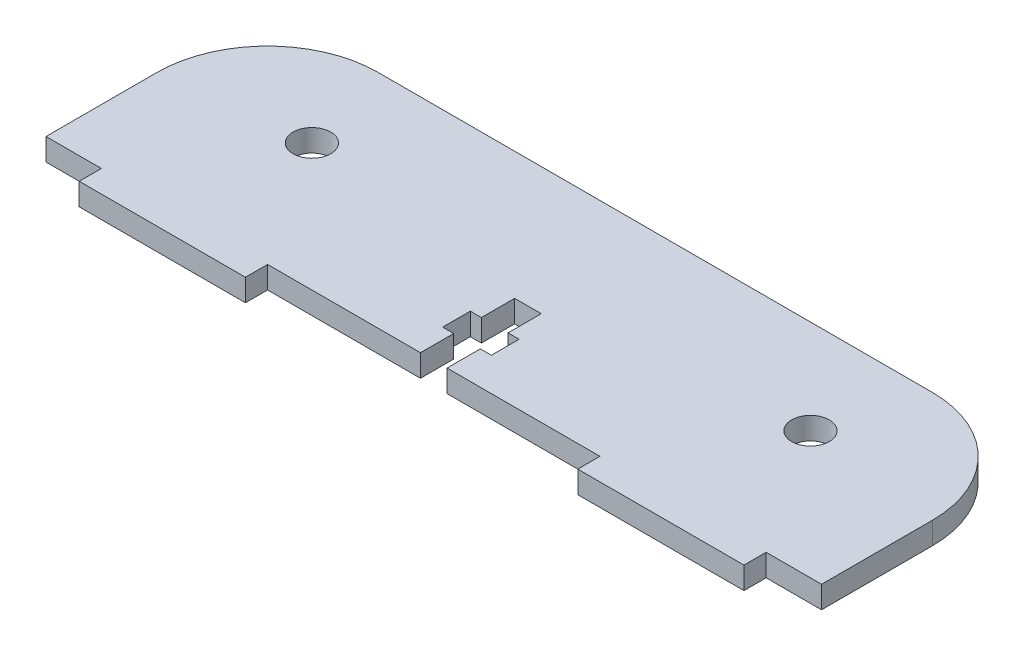
ISO-10303-21;
HEADER;
FILE_DESCRIPTION(('STEP AP214'),'2;1');
FILE_NAME('part.step','',(''),(''),'','','');
FILE_SCHEMA(('AUTOMOTIVE_DESIGN { 1 0 10303 214 1 1 1 1 }'));
ENDSEC;
DATA;
#1=APPLICATION_CONTEXT('core data for automotive mechanical design processes');
#2=APPLICATION_PROTOCOL_DEFINITION('international standard','automotive_design',2000,#1);
#3=PRODUCT_CONTEXT('',#1,'mechanical');
#4=PRODUCT('Part','Part','',(#3));
#5=PRODUCT_RELATED_PRODUCT_CATEGORY('part','',(#4));
#6=PRODUCT_DEFINITION_FORMATION('','',#4);
#7=PRODUCT_DEFINITION_CONTEXT('part definition',#1,'design');
#8=PRODUCT_DEFINITION('design','',#6,#7);
#9=PRODUCT_DEFINITION_SHAPE('','',#8);
#10=(LENGTH_UNIT() NAMED_UNIT(*) SI_UNIT(.MILLI.,.METRE.));
#11=(NAMED_UNIT(*) PLANE_ANGLE_UNIT() SI_UNIT($,.RADIAN.));
#12=(NAMED_UNIT(*) SI_UNIT($,.STERADIAN.) SOLID_ANGLE_UNIT());
#13=UNCERTAINTY_MEASURE_WITH_UNIT(LENGTH_MEASURE(1.E-05),#10,'distance_accuracy_value','');
#14=(GEOMETRIC_REPRESENTATION_CONTEXT(3) GLOBAL_UNCERTAINTY_ASSIGNED_CONTEXT((#13)) GLOBAL_UNIT_ASSIGNED_CONTEXT((#10,
#11,#12)) REPRESENTATION_CONTEXT('',''));
#15=CARTESIAN_POINT('',(0.,0.,0.));
#16=DIRECTION('',(0.,0.,1.));
#17=DIRECTION('',(1.,0.,0.));
#18=AXIS2_PLACEMENT_3D('',#15,#16,#17);
#19=CARTESIAN_POINT('',(0.,2.,20.));
#20=DIRECTION('',(0.,0.,-1.));
#21=DIRECTION('',(-1.,0.,0.));
#22=AXIS2_PLACEMENT_3D('',#19,#20,#21);
#23=PLANE('',#22);
#24=DIRECTION('',(1.,0.,0.));
#25=VECTOR('',#24,1.);
#26=CARTESIAN_POINT('',(0.,2.,20.));
#27=LINE('',#26,#25);
#28=CARTESIAN_POINT('',(65.,2.,20.));
#29=VERTEX_POINT('',#28);
#30=CARTESIAN_POINT('',(70.,2.,20.));
#31=VERTEX_POINT('',#30);
#32=EDGE_CURVE('E285',#29,#31,#27,.T.);
#33=ORIENTED_EDGE('',*,*,#32,.F.);
#34=DIRECTION('',(0.,1.,0.));
#35=VECTOR('',#34,1.);
#36=CARTESIAN_POINT('',(65.,0.,20.));
#37=LINE('',#36,#35);
#38=CARTESIAN_POINT('',(65.,0.,20.));
#39=VERTEX_POINT('',#38);
#40=EDGE_CURVE('E299',#39,#29,#37,.T.);
#41=ORIENTED_EDGE('',*,*,#40,.F.);
#42=DIRECTION('',(1.,0.,0.));
#43=VECTOR('',#42,1.);
#44=CARTESIAN_POINT('',(0.,0.,20.));
#45=LINE('',#44,#43);
#46=CARTESIAN_POINT('',(70.,0.,20.));
#47=VERTEX_POINT('',#46);
#48=EDGE_CURVE('E239',#39,#47,#45,.T.);
#49=ORIENTED_EDGE('',*,*,#48,.T.);
#50=DIRECTION('',(0.,-1.,0.));
#51=VECTOR('',#50,1.);
#52=CARTESIAN_POINT('',(70.,2.,20.));
#53=LINE('',#52,#51);
#54=EDGE_CURVE('E256',#31,#47,#53,.T.);
#55=ORIENTED_EDGE('',*,*,#54,.F.);
#56=EDGE_LOOP('',(#33,#41,#49,#55));
#57=FACE_BOUND('',#56,.T.);
#58=ADVANCED_FACE('F34',(#57),#23,.F.);
#59=CARTESIAN_POINT('',(20.,2.,20.));
#60=VERTEX_POINT('',#59);
#61=CARTESIAN_POINT('',(33.8,2.,20.));
#62=VERTEX_POINT('',#61);
#63=EDGE_CURVE('E305',#60,#62,#27,.T.);
#64=ORIENTED_EDGE('',*,*,#63,.F.);
#65=DIRECTION('',(0.,1.,0.));
#66=VECTOR('',#65,1.);
#67=CARTESIAN_POINT('',(20.,0.,20.));
#68=LINE('',#67,#66);
#69=CARTESIAN_POINT('',(20.,0.,20.));
#70=VERTEX_POINT('',#69);
#71=EDGE_CURVE('E382',#70,#60,#68,.T.);
#72=ORIENTED_EDGE('',*,*,#71,.F.);
#73=CARTESIAN_POINT('',(33.8,0.,20.));
#74=VERTEX_POINT('',#73);
#75=EDGE_CURVE('E238',#70,#74,#45,.T.);
#76=ORIENTED_EDGE('',*,*,#75,.T.);
#77=DIRECTION('',(0.,1.,0.));
#78=VECTOR('',#77,1.);
#79=CARTESIAN_POINT('',(33.8,0.,20.));
#80=LINE('',#79,#78);
#81=EDGE_CURVE('E321',#74,#62,#80,.T.);
#82=ORIENTED_EDGE('',*,*,#81,.T.);
#83=EDGE_LOOP('',(#64,#72,#76,#82));
#84=FACE_BOUND('',#83,.T.);
#85=ADVANCED_FACE('F469',(#84),#23,.F.);
#86=CARTESIAN_POINT('',(0.,0.,20.));
#87=VERTEX_POINT('',#86);
#88=CARTESIAN_POINT('',(5.,0.,20.));
#89=VERTEX_POINT('',#88);
#90=EDGE_CURVE('E241',#87,#89,#45,.T.);
#91=ORIENTED_EDGE('',*,*,#90,.T.);
#92=DIRECTION('',(0.,1.,0.));
#93=VECTOR('',#92,1.);
#94=CARTESIAN_POINT('',(5.,0.,20.));
#95=LINE('',#94,#93);
#96=CARTESIAN_POINT('',(5.,2.,20.));
#97=VERTEX_POINT('',#96);
#98=EDGE_CURVE('E413',#89,#97,#95,.T.);
#99=ORIENTED_EDGE('',*,*,#98,.T.);
#100=CARTESIAN_POINT('',(0.,2.,20.));
#101=VERTEX_POINT('',#100);
#102=EDGE_CURVE('E302',#101,#97,#27,.T.);
#103=ORIENTED_EDGE('',*,*,#102,.F.);
#104=DIRECTION('',(0.,-1.,0.));
#105=VECTOR('',#104,1.);
#106=CARTESIAN_POINT('',(0.,2.,20.));
#107=LINE('',#106,#105);
#108=EDGE_CURVE('E258',#101,#87,#107,.T.);
#109=ORIENTED_EDGE('',*,*,#108,.T.);
#110=EDGE_LOOP('',(#91,#99,#103,#109));
#111=FACE_BOUND('',#110,.T.);
#112=ADVANCED_FACE('F474',(#111),#23,.F.);
#113=CARTESIAN_POINT('',(0.,2.,0.));
#114=DIRECTION('',(0.,1.,0.));
#115=DIRECTION('',(0.,0.,1.));
#116=AXIS2_PLACEMENT_3D('',#113,#114,#115);
#117=PLANE('',#116);
#118=DIRECTION('',(-1.,0.,0.));
#119=VECTOR('',#118,1.);
#120=CARTESIAN_POINT('',(0.,2.,0.));
#121=LINE('',#120,#119);
#122=CARTESIAN_POINT('',(60.,2.,0.));
#123=VERTEX_POINT('',#122);
#124=CARTESIAN_POINT('',(10.,2.,0.));
#125=VERTEX_POINT('',#124);
#126=EDGE_CURVE('E259',#123,#125,#121,.T.);
#127=ORIENTED_EDGE('',*,*,#126,.T.);
#128=CARTESIAN_POINT('',(10.,2.,10.));
#129=DIRECTION('',(0.,1.,0.));
#130=DIRECTION('',(0.,0.,1.));
#131=AXIS2_PLACEMENT_3D('',#128,#129,#130);
#132=CIRCLE('',#131,10.);
#133=CARTESIAN_POINT('',(0.,2.,10.));
#134=VERTEX_POINT('',#133);
#135=EDGE_CURVE('E42',#125,#134,#132,.T.);
#136=ORIENTED_EDGE('',*,*,#135,.T.);
#137=DIRECTION('',(0.,0.,1.));
#138=VECTOR('',#137,1.);
#139=CARTESIAN_POINT('',(0.,2.,0.));
#140=LINE('',#139,#138);
#141=EDGE_CURVE('E253',#134,#101,#140,.T.);
#142=ORIENTED_EDGE('',*,*,#141,.T.);
#143=ORIENTED_EDGE('',*,*,#102,.T.);
#144=DIRECTION('',(0.,0.,1.));
#145=VECTOR('',#144,1.);
#146=CARTESIAN_POINT('',(5.,2.,22.));
#147=LINE('',#146,#145);
#148=CARTESIAN_POINT('',(5.,2.,22.));
#149=VERTEX_POINT('',#148);
#150=EDGE_CURVE('E429',#97,#149,#147,.T.);
#151=ORIENTED_EDGE('',*,*,#150,.T.);
#152=DIRECTION('',(1.,0.,0.));
#153=VECTOR('',#152,1.);
#154=CARTESIAN_POINT('',(20.,2.,22.));
#155=LINE('',#154,#153);
#156=CARTESIAN_POINT('',(20.,2.,22.));
#157=VERTEX_POINT('',#156);
#158=EDGE_CURVE('E426',#149,#157,#155,.T.);
#159=ORIENTED_EDGE('',*,*,#158,.T.);
#160=DIRECTION('',(0.,0.,-1.));
#161=VECTOR('',#160,1.);
#162=CARTESIAN_POINT('',(20.,2.,20.));
#163=LINE('',#162,#161);
#164=EDGE_CURVE('E422',#157,#60,#163,.T.);
#165=ORIENTED_EDGE('',*,*,#164,.T.);
#166=ORIENTED_EDGE('',*,*,#63,.T.);
#167=DIRECTION('',(0.,0.,1.));
#168=VECTOR('',#167,1.);
#169=CARTESIAN_POINT('',(33.8,2.,20.));
#170=LINE('',#169,#168);
#171=CARTESIAN_POINT('',(33.8,2.,17.));
#172=VERTEX_POINT('',#171);
#173=EDGE_CURVE('E348',#172,#62,#170,.T.);
#174=ORIENTED_EDGE('',*,*,#173,.F.);
#175=DIRECTION('',(1.,0.,0.));
#176=VECTOR('',#175,1.);
#177=CARTESIAN_POINT('',(33.8,2.,17.));
#178=LINE('',#177,#176);
#179=CARTESIAN_POINT('',(32.8,2.,17.));
#180=VERTEX_POINT('',#179);
#181=EDGE_CURVE('E352',#180,#172,#178,.T.);
#182=ORIENTED_EDGE('',*,*,#181,.F.);
#183=DIRECTION('',(0.,0.,1.));
#184=VECTOR('',#183,1.);
#185=CARTESIAN_POINT('',(32.8,2.,17.));
#186=LINE('',#185,#184);
#187=CARTESIAN_POINT('',(32.8,2.,14.5));
#188=VERTEX_POINT('',#187);
#189=EDGE_CURVE('E355',#188,#180,#186,.T.);
#190=ORIENTED_EDGE('',*,*,#189,.F.);
#191=DIRECTION('',(-1.,0.,0.));
#192=VECTOR('',#191,1.);
#193=CARTESIAN_POINT('',(32.8,2.,14.5));
#194=LINE('',#193,#192);
#195=CARTESIAN_POINT('',(33.8,2.,14.5));
#196=VERTEX_POINT('',#195);
#197=EDGE_CURVE('E358',#196,#188,#194,.T.);
#198=ORIENTED_EDGE('',*,*,#197,.F.);
#199=DIRECTION('',(0.,0.,1.));
#200=VECTOR('',#199,1.);
#201=CARTESIAN_POINT('',(33.8,2.,14.5));
#202=LINE('',#201,#200);
#203=CARTESIAN_POINT('',(33.8,2.,11.5));
#204=VERTEX_POINT('',#203);
#205=EDGE_CURVE('E361',#204,#196,#202,.T.);
#206=ORIENTED_EDGE('',*,*,#205,.F.);
#207=DIRECTION('',(-1.,0.,0.));
#208=VECTOR('',#207,1.);
#209=CARTESIAN_POINT('',(33.8,2.,11.5));
#210=LINE('',#209,#208);
#211=CARTESIAN_POINT('',(36.2,2.,11.5));
#212=VERTEX_POINT('',#211);
#213=EDGE_CURVE('E364',#212,#204,#210,.T.);
#214=ORIENTED_EDGE('',*,*,#213,.F.);
#215=DIRECTION('',(0.,0.,-1.));
#216=VECTOR('',#215,1.);
#217=CARTESIAN_POINT('',(36.2,2.,11.5));
#218=LINE('',#217,#216);
#219=CARTESIAN_POINT('',(36.2,2.,14.5));
#220=VERTEX_POINT('',#219);
#221=EDGE_CURVE('E367',#220,#212,#218,.T.);
#222=ORIENTED_EDGE('',*,*,#221,.F.);
#223=DIRECTION('',(-1.,0.,0.));
#224=VECTOR('',#223,1.);
#225=CARTESIAN_POINT('',(36.2,2.,14.5));
#226=LINE('',#225,#224);
#227=CARTESIAN_POINT('',(37.2,2.,14.5));
#228=VERTEX_POINT('',#227);
#229=EDGE_CURVE('E370',#228,#220,#226,.T.);
#230=ORIENTED_EDGE('',*,*,#229,.F.);
#231=DIRECTION('',(0.,0.,-1.));
#232=VECTOR('',#231,1.);
#233=CARTESIAN_POINT('',(37.2,2.,14.5));
#234=LINE('',#233,#232);
#235=CARTESIAN_POINT('',(37.2,2.,17.));
#236=VERTEX_POINT('',#235);
#237=EDGE_CURVE('E373',#236,#228,#234,.T.);
#238=ORIENTED_EDGE('',*,*,#237,.F.);
#239=DIRECTION('',(1.,0.,0.));
#240=VECTOR('',#239,1.);
#241=CARTESIAN_POINT('',(37.2,2.,17.));
#242=LINE('',#241,#240);
#243=CARTESIAN_POINT('',(36.2,2.,17.));
#244=VERTEX_POINT('',#243);
#245=EDGE_CURVE('E376',#244,#236,#242,.T.);
#246=ORIENTED_EDGE('',*,*,#245,.F.);
#247=DIRECTION('',(0.,0.,-1.));
#248=VECTOR('',#247,1.);
#249=CARTESIAN_POINT('',(36.2,2.,17.));
#250=LINE('',#249,#248);
#251=CARTESIAN_POINT('',(36.2,2.,20.));
#252=VERTEX_POINT('',#251);
#253=EDGE_CURVE('E379',#252,#244,#250,.T.);
#254=ORIENTED_EDGE('',*,*,#253,.F.);
#255=CARTESIAN_POINT('',(50.,2.,20.));
#256=VERTEX_POINT('',#255);
#257=EDGE_CURVE('E307',#252,#256,#27,.T.);
#258=ORIENTED_EDGE('',*,*,#257,.T.);
#259=DIRECTION('',(0.,0.,1.));
#260=VECTOR('',#259,1.);
#261=CARTESIAN_POINT('',(50.,2.,20.));
#262=LINE('',#261,#260);
#263=CARTESIAN_POINT('',(50.,2.,22.));
#264=VERTEX_POINT('',#263);
#265=EDGE_CURVE('E214',#256,#264,#262,.T.);
#266=ORIENTED_EDGE('',*,*,#265,.T.);
#267=DIRECTION('',(1.,0.,0.));
#268=VECTOR('',#267,1.);
#269=CARTESIAN_POINT('',(50.,2.,22.));
#270=LINE('',#269,#268);
#271=CARTESIAN_POINT('',(65.,2.,22.));
#272=VERTEX_POINT('',#271);
#273=EDGE_CURVE('E444',#264,#272,#270,.T.);
#274=ORIENTED_EDGE('',*,*,#273,.T.);
#275=DIRECTION('',(0.,0.,-1.));
#276=VECTOR('',#275,1.);
#277=CARTESIAN_POINT('',(65.,2.,22.));
#278=LINE('',#277,#276);
#279=EDGE_CURVE('E233',#272,#29,#278,.T.);
#280=ORIENTED_EDGE('',*,*,#279,.T.);
#281=ORIENTED_EDGE('',*,*,#32,.T.);
#282=DIRECTION('',(0.,0.,-1.));
#283=VECTOR('',#282,1.);
#284=CARTESIAN_POINT('',(70.,2.,0.));
#285=LINE('',#284,#283);
#286=CARTESIAN_POINT('',(70.,2.,10.));
#287=VERTEX_POINT('',#286);
#288=EDGE_CURVE('E301',#31,#287,#285,.T.);
#289=ORIENTED_EDGE('',*,*,#288,.T.);
#290=CARTESIAN_POINT('',(60.,2.,10.));
#291=DIRECTION('',(0.,1.,0.));
#292=DIRECTION('',(0.,0.,1.));
#293=AXIS2_PLACEMENT_3D('',#290,#291,#292);
#294=CIRCLE('',#293,10.);
#295=EDGE_CURVE('E272',#287,#123,#294,.T.);
#296=ORIENTED_EDGE('',*,*,#295,.T.);
#297=EDGE_LOOP('',(#127,#136,#142,#143,#151,#159,#165,#166,#174,#182,#190,#198,#206,#214,#222,
#230,#238,#246,#254,#258,#266,#274,#280,#281,#289,#296));
#298=FACE_BOUND('',#297,.T.);
#299=CARTESIAN_POINT('',(57.5,2.,8.5));
#300=DIRECTION('',(0.,1.,0.));
#301=DIRECTION('',(0.,0.,1.));
#302=AXIS2_PLACEMENT_3D('',#299,#300,#301);
#303=CIRCLE('',#302,1.7);
#304=CARTESIAN_POINT('',(57.5,2.,10.2));
#305=VERTEX_POINT('',#304);
#306=EDGE_CURVE('E308',#305,#305,#303,.T.);
#307=ORIENTED_EDGE('',*,*,#306,.F.);
#308=EDGE_LOOP('',(#307));
#309=FACE_BOUND('',#308,.T.);
#310=CARTESIAN_POINT('',(12.5,2.,8.5));
#311=DIRECTION('',(0.,1.,0.));
#312=DIRECTION('',(0.,0.,1.));
#313=AXIS2_PLACEMENT_3D('',#310,#311,#312);
#314=CIRCLE('',#313,1.7);
#315=CARTESIAN_POINT('',(12.5,2.,10.2));
#316=VERTEX_POINT('',#315);
#317=EDGE_CURVE('E315',#316,#316,#314,.T.);
#318=ORIENTED_EDGE('',*,*,#317,.F.);
#319=EDGE_LOOP('',(#318));
#320=FACE_BOUND('',#319,.T.);
#321=ADVANCED_FACE('F276',(#298,#309,#320),#117,.T.);
#322=CARTESIAN_POINT('',(0.,0.,0.));
#323=DIRECTION('',(0.,1.,0.));
#324=DIRECTION('',(0.,0.,1.));
#325=AXIS2_PLACEMENT_3D('',#322,#323,#324);
#326=PLANE('',#325);
#327=DIRECTION('',(0.,0.,1.));
#328=VECTOR('',#327,1.);
#329=CARTESIAN_POINT('',(0.,0.,0.));
#330=LINE('',#329,#328);
#331=CARTESIAN_POINT('',(0.,0.,10.));
#332=VERTEX_POINT('',#331);
#333=EDGE_CURVE('E242',#332,#87,#330,.T.);
#334=ORIENTED_EDGE('',*,*,#333,.F.);
#335=CARTESIAN_POINT('',(10.,0.,10.));
#336=DIRECTION('',(0.,1.,0.));
#337=DIRECTION('',(0.,0.,1.));
#338=AXIS2_PLACEMENT_3D('',#335,#336,#337);
#339=CIRCLE('',#338,10.);
#340=CARTESIAN_POINT('',(10.,0.,0.));
#341=VERTEX_POINT('',#340);
#342=EDGE_CURVE('E266',#332,#341,#339,.F.);
#343=ORIENTED_EDGE('',*,*,#342,.T.);
#344=DIRECTION('',(-1.,0.,0.));
#345=VECTOR('',#344,1.);
#346=CARTESIAN_POINT('',(0.,0.,0.));
#347=LINE('',#346,#345);
#348=CARTESIAN_POINT('',(60.,0.,0.));
#349=VERTEX_POINT('',#348);
#350=EDGE_CURVE('E250',#349,#341,#347,.T.);
#351=ORIENTED_EDGE('',*,*,#350,.F.);
#352=CARTESIAN_POINT('',(60.,0.,10.));
#353=DIRECTION('',(0.,1.,0.));
#354=DIRECTION('',(0.,0.,1.));
#355=AXIS2_PLACEMENT_3D('',#352,#353,#354);
#356=CIRCLE('',#355,10.);
#357=CARTESIAN_POINT('',(70.,0.,10.));
#358=VERTEX_POINT('',#357);
#359=EDGE_CURVE('E264',#349,#358,#356,.F.);
#360=ORIENTED_EDGE('',*,*,#359,.T.);
#361=DIRECTION('',(0.,0.,-1.));
#362=VECTOR('',#361,1.);
#363=CARTESIAN_POINT('',(70.,0.,0.));
#364=LINE('',#363,#362);
#365=EDGE_CURVE('E245',#47,#358,#364,.T.);
#366=ORIENTED_EDGE('',*,*,#365,.F.);
#367=ORIENTED_EDGE('',*,*,#48,.F.);
#368=DIRECTION('',(0.,0.,-1.));
#369=VECTOR('',#368,1.);
#370=CARTESIAN_POINT('',(65.,0.,22.));
#371=LINE('',#370,#369);
#372=CARTESIAN_POINT('',(65.,0.,22.));
#373=VERTEX_POINT('',#372);
#374=EDGE_CURVE('E220',#373,#39,#371,.T.);
#375=ORIENTED_EDGE('',*,*,#374,.F.);
#376=DIRECTION('',(1.,0.,0.));
#377=VECTOR('',#376,1.);
#378=CARTESIAN_POINT('',(50.,0.,22.));
#379=LINE('',#378,#377);
#380=CARTESIAN_POINT('',(50.,0.,22.));
#381=VERTEX_POINT('',#380);
#382=EDGE_CURVE('E232',#381,#373,#379,.T.);
#383=ORIENTED_EDGE('',*,*,#382,.F.);
#384=DIRECTION('',(0.,0.,1.));
#385=VECTOR('',#384,1.);
#386=CARTESIAN_POINT('',(50.,0.,20.));
#387=LINE('',#386,#385);
#388=CARTESIAN_POINT('',(50.,0.,20.));
#389=VERTEX_POINT('',#388);
#390=EDGE_CURVE('E212',#389,#381,#387,.T.);
#391=ORIENTED_EDGE('',*,*,#390,.F.);
#392=CARTESIAN_POINT('',(36.2,0.,20.));
#393=VERTEX_POINT('',#392);
#394=EDGE_CURVE('E229',#393,#389,#45,.T.);
#395=ORIENTED_EDGE('',*,*,#394,.F.);
#396=DIRECTION('',(0.,0.,-1.));
#397=VECTOR('',#396,1.);
#398=CARTESIAN_POINT('',(36.2,0.,17.));
#399=LINE('',#398,#397);
#400=CARTESIAN_POINT('',(36.2,0.,17.));
#401=VERTEX_POINT('',#400);
#402=EDGE_CURVE('E351',#393,#401,#399,.T.);
#403=ORIENTED_EDGE('',*,*,#402,.T.);
#404=DIRECTION('',(1.,0.,0.));
#405=VECTOR('',#404,1.);
#406=CARTESIAN_POINT('',(37.2,0.,17.));
#407=LINE('',#406,#405);
#408=CARTESIAN_POINT('',(37.2,0.,17.));
#409=VERTEX_POINT('',#408);
#410=EDGE_CURVE('E409',#401,#409,#407,.T.);
#411=ORIENTED_EDGE('',*,*,#410,.T.);
#412=DIRECTION('',(0.,0.,-1.));
#413=VECTOR('',#412,1.);
#414=CARTESIAN_POINT('',(37.2,0.,14.5));
#415=LINE('',#414,#413);
#416=CARTESIAN_POINT('',(37.2,0.,14.5));
#417=VERTEX_POINT('',#416);
#418=EDGE_CURVE('E406',#409,#417,#415,.T.);
#419=ORIENTED_EDGE('',*,*,#418,.T.);
#420=DIRECTION('',(-1.,0.,0.));
#421=VECTOR('',#420,1.);
#422=CARTESIAN_POINT('',(36.2,0.,14.5));
#423=LINE('',#422,#421);
#424=CARTESIAN_POINT('',(36.2,0.,14.5));
#425=VERTEX_POINT('',#424);
#426=EDGE_CURVE('E403',#417,#425,#423,.T.);
#427=ORIENTED_EDGE('',*,*,#426,.T.);
#428=DIRECTION('',(0.,0.,-1.));
#429=VECTOR('',#428,1.);
#430=CARTESIAN_POINT('',(36.2,0.,11.5));
#431=LINE('',#430,#429);
#432=CARTESIAN_POINT('',(36.2,0.,11.5));
#433=VERTEX_POINT('',#432);
#434=EDGE_CURVE('E400',#425,#433,#431,.T.);
#435=ORIENTED_EDGE('',*,*,#434,.T.);
#436=DIRECTION('',(-1.,0.,0.));
#437=VECTOR('',#436,1.);
#438=CARTESIAN_POINT('',(33.8,0.,11.5));
#439=LINE('',#438,#437);
#440=CARTESIAN_POINT('',(33.8,0.,11.5));
#441=VERTEX_POINT('',#440);
#442=EDGE_CURVE('E397',#433,#441,#439,.T.);
#443=ORIENTED_EDGE('',*,*,#442,.T.);
#444=DIRECTION('',(0.,0.,1.));
#445=VECTOR('',#444,1.);
#446=CARTESIAN_POINT('',(33.8,0.,14.5));
#447=LINE('',#446,#445);
#448=CARTESIAN_POINT('',(33.8,0.,14.5));
#449=VERTEX_POINT('',#448);
#450=EDGE_CURVE('E394',#441,#449,#447,.T.);
#451=ORIENTED_EDGE('',*,*,#450,.T.);
#452=DIRECTION('',(-1.,0.,0.));
#453=VECTOR('',#452,1.);
#454=CARTESIAN_POINT('',(32.8,0.,14.5));
#455=LINE('',#454,#453);
#456=CARTESIAN_POINT('',(32.8,0.,14.5));
#457=VERTEX_POINT('',#456);
#458=EDGE_CURVE('E391',#449,#457,#455,.T.);
#459=ORIENTED_EDGE('',*,*,#458,.T.);
#460=DIRECTION('',(0.,0.,1.));
#461=VECTOR('',#460,1.);
#462=CARTESIAN_POINT('',(32.8,0.,17.));
#463=LINE('',#462,#461);
#464=CARTESIAN_POINT('',(32.8,0.,17.));
#465=VERTEX_POINT('',#464);
#466=EDGE_CURVE('E388',#457,#465,#463,.T.);
#467=ORIENTED_EDGE('',*,*,#466,.T.);
#468=DIRECTION('',(1.,0.,0.));
#469=VECTOR('',#468,1.);
#470=CARTESIAN_POINT('',(33.8,0.,17.));
#471=LINE('',#470,#469);
#472=CARTESIAN_POINT('',(33.8,0.,17.));
#473=VERTEX_POINT('',#472);
#474=EDGE_CURVE('E385',#465,#473,#471,.T.);
#475=ORIENTED_EDGE('',*,*,#474,.T.);
#476=DIRECTION('',(0.,0.,1.));
#477=VECTOR('',#476,1.);
#478=CARTESIAN_POINT('',(33.8,0.,20.));
#479=LINE('',#478,#477);
#480=EDGE_CURVE('E326',#473,#74,#479,.T.);
#481=ORIENTED_EDGE('',*,*,#480,.T.);
#482=ORIENTED_EDGE('',*,*,#75,.F.);
#483=DIRECTION('',(0.,0.,-1.));
#484=VECTOR('',#483,1.);
#485=CARTESIAN_POINT('',(20.,0.,20.));
#486=LINE('',#485,#484);
#487=CARTESIAN_POINT('',(20.,0.,22.));
#488=VERTEX_POINT('',#487);
#489=EDGE_CURVE('E416',#488,#70,#486,.T.);
#490=ORIENTED_EDGE('',*,*,#489,.F.);
#491=DIRECTION('',(1.,0.,0.));
#492=VECTOR('',#491,1.);
#493=CARTESIAN_POINT('',(20.,0.,22.));
#494=LINE('',#493,#492);
#495=CARTESIAN_POINT('',(5.,0.,22.));
#496=VERTEX_POINT('',#495);
#497=EDGE_CURVE('E434',#496,#488,#494,.T.);
#498=ORIENTED_EDGE('',*,*,#497,.F.);
#499=DIRECTION('',(0.,0.,1.));
#500=VECTOR('',#499,1.);
#501=CARTESIAN_POINT('',(5.,0.,22.));
#502=LINE('',#501,#500);
#503=EDGE_CURVE('E425',#89,#496,#502,.T.);
#504=ORIENTED_EDGE('',*,*,#503,.F.);
#505=ORIENTED_EDGE('',*,*,#90,.F.);
#506=EDGE_LOOP('',(#334,#343,#351,#360,#366,#367,#375,#383,#391,#395,#403,#411,#419,#427,#435,
#443,#451,#459,#467,#475,#481,#482,#490,#498,#504,#505));
#507=FACE_BOUND('',#506,.T.);
#508=CARTESIAN_POINT('',(57.5,0.,8.5));
#509=DIRECTION('',(0.,1.,0.));
#510=DIRECTION('',(0.,0.,1.));
#511=AXIS2_PLACEMENT_3D('',#508,#509,#510);
#512=CIRCLE('',#511,1.7);
#513=CARTESIAN_POINT('',(57.5,0.,10.2));
#514=VERTEX_POINT('',#513);
#515=EDGE_CURVE('E310',#514,#514,#512,.T.);
#516=ORIENTED_EDGE('',*,*,#515,.T.);
#517=EDGE_LOOP('',(#516));
#518=FACE_BOUND('',#517,.T.);
#519=CARTESIAN_POINT('',(12.5,0.,8.5));
#520=DIRECTION('',(0.,1.,0.));
#521=DIRECTION('',(0.,0.,1.));
#522=AXIS2_PLACEMENT_3D('',#519,#520,#521);
#523=CIRCLE('',#522,1.7);
#524=CARTESIAN_POINT('',(12.5,0.,10.2));
#525=VERTEX_POINT('',#524);
#526=EDGE_CURVE('E318',#525,#525,#523,.T.);
#527=ORIENTED_EDGE('',*,*,#526,.T.);
#528=EDGE_LOOP('',(#527));
#529=FACE_BOUND('',#528,.T.);
#530=ADVANCED_FACE('F226',(#507,#518,#529),#326,.F.);
#531=CARTESIAN_POINT('',(0.,2.,0.));
#532=DIRECTION('',(1.,0.,0.));
#533=DIRECTION('',(0.,0.,-1.));
#534=AXIS2_PLACEMENT_3D('',#531,#532,#533);
#535=PLANE('',#534);
#536=ORIENTED_EDGE('',*,*,#141,.F.);
#537=DIRECTION('',(0.,-1.,0.));
#538=VECTOR('',#537,1.);
#539=CARTESIAN_POINT('',(0.,2.,10.));
#540=LINE('',#539,#538);
#541=EDGE_CURVE('E261',#134,#332,#540,.T.);
#542=ORIENTED_EDGE('',*,*,#541,.T.);
#543=ORIENTED_EDGE('',*,*,#333,.T.);
#544=ORIENTED_EDGE('',*,*,#108,.F.);
#545=EDGE_LOOP('',(#536,#542,#543,#544));
#546=FACE_BOUND('',#545,.T.);
#547=ADVANCED_FACE('F284',(#546),#535,.F.);
#548=ORIENTED_EDGE('',*,*,#394,.T.);
#549=DIRECTION('',(0.,1.,0.));
#550=VECTOR('',#549,1.);
#551=CARTESIAN_POINT('',(50.,0.,20.));
#552=LINE('',#551,#550);
#553=EDGE_CURVE('E209',#389,#256,#552,.T.);
#554=ORIENTED_EDGE('',*,*,#553,.T.);
#555=ORIENTED_EDGE('',*,*,#257,.F.);
#556=DIRECTION('',(0.,1.,0.));
#557=VECTOR('',#556,1.);
#558=CARTESIAN_POINT('',(36.2,0.,20.));
#559=LINE('',#558,#557);
#560=EDGE_CURVE('E237',#393,#252,#559,.T.);
#561=ORIENTED_EDGE('',*,*,#560,.F.);
#562=EDGE_LOOP('',(#548,#554,#555,#561));
#563=FACE_BOUND('',#562,.T.);
#564=ADVANCED_FACE('F236',(#563),#23,.F.);
#565=CARTESIAN_POINT('',(70.,2.,0.));
#566=DIRECTION('',(-1.,0.,0.));
#567=DIRECTION('',(0.,0.,1.));
#568=AXIS2_PLACEMENT_3D('',#565,#566,#567);
#569=PLANE('',#568);
#570=ORIENTED_EDGE('',*,*,#365,.T.);
#571=DIRECTION('',(0.,-1.,0.));
#572=VECTOR('',#571,1.);
#573=CARTESIAN_POINT('',(70.,2.,10.));
#574=LINE('',#573,#572);
#575=EDGE_CURVE('E11',#358,#287,#574,.F.);
#576=ORIENTED_EDGE('',*,*,#575,.T.);
#577=ORIENTED_EDGE('',*,*,#288,.F.);
#578=ORIENTED_EDGE('',*,*,#54,.T.);
#579=EDGE_LOOP('',(#570,#576,#577,#578));
#580=FACE_BOUND('',#579,.T.);
#581=ADVANCED_FACE('F300',(#580),#569,.F.);
#582=CARTESIAN_POINT('',(0.,2.,0.));
#583=DIRECTION('',(0.,0.,1.));
#584=DIRECTION('',(1.,0.,0.));
#585=AXIS2_PLACEMENT_3D('',#582,#583,#584);
#586=PLANE('',#585);
#587=ORIENTED_EDGE('',*,*,#350,.T.);
#588=DIRECTION('',(0.,-1.,0.));
#589=VECTOR('',#588,1.);
#590=CARTESIAN_POINT('',(10.,2.,0.));
#591=LINE('',#590,#589);
#592=EDGE_CURVE('E55',#341,#125,#591,.F.);
#593=ORIENTED_EDGE('',*,*,#592,.T.);
#594=ORIENTED_EDGE('',*,*,#126,.F.);
#595=DIRECTION('',(0.,-1.,0.));
#596=VECTOR('',#595,1.);
#597=CARTESIAN_POINT('',(60.,2.,0.));
#598=LINE('',#597,#596);
#599=EDGE_CURVE('E268',#123,#349,#598,.T.);
#600=ORIENTED_EDGE('',*,*,#599,.T.);
#601=EDGE_LOOP('',(#587,#593,#594,#600));
#602=FACE_BOUND('',#601,.T.);
#603=ADVANCED_FACE('F289',(#602),#586,.F.);
#604=CARTESIAN_POINT('',(57.5,2.,8.5));
#605=DIRECTION('',(0.,-1.,0.));
#606=DIRECTION('',(0.,0.,-1.));
#607=AXIS2_PLACEMENT_3D('',#604,#605,#606);
#608=CYLINDRICAL_SURFACE('',#607,1.7);
#609=ORIENTED_EDGE('',*,*,#306,.T.);
#610=EDGE_LOOP('',(#609));
#611=FACE_BOUND('',#610,.T.);
#612=ORIENTED_EDGE('',*,*,#515,.F.);
#613=EDGE_LOOP('',(#612));
#614=FACE_BOUND('',#613,.T.);
#615=ADVANCED_FACE('F493',(#611,#614),#608,.F.);
#616=CARTESIAN_POINT('',(12.5,2.,8.5));
#617=DIRECTION('',(0.,-1.,0.));
#618=DIRECTION('',(0.,0.,-1.));
#619=AXIS2_PLACEMENT_3D('',#616,#617,#618);
#620=CYLINDRICAL_SURFACE('',#619,1.7);
#621=ORIENTED_EDGE('',*,*,#317,.T.);
#622=EDGE_LOOP('',(#621));
#623=FACE_BOUND('',#622,.T.);
#624=ORIENTED_EDGE('',*,*,#526,.F.);
#625=EDGE_LOOP('',(#624));
#626=FACE_BOUND('',#625,.T.);
#627=ADVANCED_FACE('F500',(#623,#626),#620,.F.);
#628=CARTESIAN_POINT('',(33.8,0.,20.));
#629=DIRECTION('',(-1.,0.,0.));
#630=DIRECTION('',(0.,0.,1.));
#631=AXIS2_PLACEMENT_3D('',#628,#629,#630);
#632=PLANE('',#631);
#633=ORIENTED_EDGE('',*,*,#173,.T.);
#634=ORIENTED_EDGE('',*,*,#81,.F.);
#635=ORIENTED_EDGE('',*,*,#480,.F.);
#636=DIRECTION('',(0.,1.,0.));
#637=VECTOR('',#636,1.);
#638=CARTESIAN_POINT('',(33.8,0.,17.));
#639=LINE('',#638,#637);
#640=EDGE_CURVE('E344',#473,#172,#639,.T.);
#641=ORIENTED_EDGE('',*,*,#640,.T.);
#642=EDGE_LOOP('',(#633,#634,#635,#641));
#643=FACE_BOUND('',#642,.T.);
#644=ADVANCED_FACE('F504',(#643),#632,.F.);
#645=CARTESIAN_POINT('',(33.8,0.,17.));
#646=DIRECTION('',(0.,0.,1.));
#647=DIRECTION('',(1.,0.,0.));
#648=AXIS2_PLACEMENT_3D('',#645,#646,#647);
#649=PLANE('',#648);
#650=ORIENTED_EDGE('',*,*,#181,.T.);
#651=ORIENTED_EDGE('',*,*,#640,.F.);
#652=ORIENTED_EDGE('',*,*,#474,.F.);
#653=DIRECTION('',(0.,1.,0.));
#654=VECTOR('',#653,1.);
#655=CARTESIAN_POINT('',(32.8,0.,17.));
#656=LINE('',#655,#654);
#657=EDGE_CURVE('E342',#465,#180,#656,.T.);
#658=ORIENTED_EDGE('',*,*,#657,.T.);
#659=EDGE_LOOP('',(#650,#651,#652,#658));
#660=FACE_BOUND('',#659,.T.);
#661=ADVANCED_FACE('F514',(#660),#649,.F.);
#662=CARTESIAN_POINT('',(32.8,0.,17.));
#663=DIRECTION('',(-1.,0.,0.));
#664=DIRECTION('',(0.,0.,1.));
#665=AXIS2_PLACEMENT_3D('',#662,#663,#664);
#666=PLANE('',#665);
#667=ORIENTED_EDGE('',*,*,#189,.T.);
#668=ORIENTED_EDGE('',*,*,#657,.F.);
#669=ORIENTED_EDGE('',*,*,#466,.F.);
#670=DIRECTION('',(0.,1.,0.));
#671=VECTOR('',#670,1.);
#672=CARTESIAN_POINT('',(32.8,0.,14.5));
#673=LINE('',#672,#671);
#674=EDGE_CURVE('E340',#457,#188,#673,.T.);
#675=ORIENTED_EDGE('',*,*,#674,.T.);
#676=EDGE_LOOP('',(#667,#668,#669,#675));
#677=FACE_BOUND('',#676,.T.);
#678=ADVANCED_FACE('F550',(#677),#666,.F.);
#679=CARTESIAN_POINT('',(32.8,0.,14.5));
#680=DIRECTION('',(0.,0.,-1.));
#681=DIRECTION('',(-1.,0.,0.));
#682=AXIS2_PLACEMENT_3D('',#679,#680,#681);
#683=PLANE('',#682);
#684=ORIENTED_EDGE('',*,*,#197,.T.);
#685=ORIENTED_EDGE('',*,*,#674,.F.);
#686=ORIENTED_EDGE('',*,*,#458,.F.);
#687=DIRECTION('',(0.,1.,0.));
#688=VECTOR('',#687,1.);
#689=CARTESIAN_POINT('',(33.8,0.,14.5));
#690=LINE('',#689,#688);
#691=EDGE_CURVE('E338',#449,#196,#690,.T.);
#692=ORIENTED_EDGE('',*,*,#691,.T.);
#693=EDGE_LOOP('',(#684,#685,#686,#692));
#694=FACE_BOUND('',#693,.T.);
#695=ADVANCED_FACE('F546',(#694),#683,.F.);
#696=CARTESIAN_POINT('',(33.8,0.,14.5));
#697=DIRECTION('',(-1.,0.,0.));
#698=DIRECTION('',(0.,0.,1.));
#699=AXIS2_PLACEMENT_3D('',#696,#697,#698);
#700=PLANE('',#699);
#701=ORIENTED_EDGE('',*,*,#205,.T.);
#702=ORIENTED_EDGE('',*,*,#691,.F.);
#703=ORIENTED_EDGE('',*,*,#450,.F.);
#704=DIRECTION('',(0.,1.,0.));
#705=VECTOR('',#704,1.);
#706=CARTESIAN_POINT('',(33.8,0.,11.5));
#707=LINE('',#706,#705);
#708=EDGE_CURVE('E336',#441,#204,#707,.T.);
#709=ORIENTED_EDGE('',*,*,#708,.T.);
#710=EDGE_LOOP('',(#701,#702,#703,#709));
#711=FACE_BOUND('',#710,.T.);
#712=ADVANCED_FACE('F542',(#711),#700,.F.);
#713=CARTESIAN_POINT('',(33.8,0.,11.5));
#714=DIRECTION('',(0.,0.,-1.));
#715=DIRECTION('',(-1.,0.,0.));
#716=AXIS2_PLACEMENT_3D('',#713,#714,#715);
#717=PLANE('',#716);
#718=ORIENTED_EDGE('',*,*,#213,.T.);
#719=ORIENTED_EDGE('',*,*,#708,.F.);
#720=ORIENTED_EDGE('',*,*,#442,.F.);
#721=DIRECTION('',(0.,1.,0.));
#722=VECTOR('',#721,1.);
#723=CARTESIAN_POINT('',(36.2,0.,11.5));
#724=LINE('',#723,#722);
#725=EDGE_CURVE('E334',#433,#212,#724,.T.);
#726=ORIENTED_EDGE('',*,*,#725,.T.);
#727=EDGE_LOOP('',(#718,#719,#720,#726));
#728=FACE_BOUND('',#727,.T.);
#729=ADVANCED_FACE('F538',(#728),#717,.F.);
#730=CARTESIAN_POINT('',(36.2,0.,11.5));
#731=DIRECTION('',(1.,0.,0.));
#732=DIRECTION('',(0.,0.,-1.));
#733=AXIS2_PLACEMENT_3D('',#730,#731,#732);
#734=PLANE('',#733);
#735=ORIENTED_EDGE('',*,*,#221,.T.);
#736=ORIENTED_EDGE('',*,*,#725,.F.);
#737=ORIENTED_EDGE('',*,*,#434,.F.);
#738=DIRECTION('',(0.,1.,0.));
#739=VECTOR('',#738,1.);
#740=CARTESIAN_POINT('',(36.2,0.,14.5));
#741=LINE('',#740,#739);
#742=EDGE_CURVE('E332',#425,#220,#741,.T.);
#743=ORIENTED_EDGE('',*,*,#742,.T.);
#744=EDGE_LOOP('',(#735,#736,#737,#743));
#745=FACE_BOUND('',#744,.T.);
#746=ADVANCED_FACE('F534',(#745),#734,.F.);
#747=CARTESIAN_POINT('',(36.2,0.,14.5));
#748=DIRECTION('',(0.,0.,-1.));
#749=DIRECTION('',(-1.,0.,0.));
#750=AXIS2_PLACEMENT_3D('',#747,#748,#749);
#751=PLANE('',#750);
#752=ORIENTED_EDGE('',*,*,#229,.T.);
#753=ORIENTED_EDGE('',*,*,#742,.F.);
#754=ORIENTED_EDGE('',*,*,#426,.F.);
#755=DIRECTION('',(0.,1.,0.));
#756=VECTOR('',#755,1.);
#757=CARTESIAN_POINT('',(37.2,0.,14.5));
#758=LINE('',#757,#756);
#759=EDGE_CURVE('E330',#417,#228,#758,.T.);
#760=ORIENTED_EDGE('',*,*,#759,.T.);
#761=EDGE_LOOP('',(#752,#753,#754,#760));
#762=FACE_BOUND('',#761,.T.);
#763=ADVANCED_FACE('F530',(#762),#751,.F.);
#764=CARTESIAN_POINT('',(37.2,0.,14.5));
#765=DIRECTION('',(1.,0.,0.));
#766=DIRECTION('',(0.,0.,-1.));
#767=AXIS2_PLACEMENT_3D('',#764,#765,#766);
#768=PLANE('',#767);
#769=ORIENTED_EDGE('',*,*,#237,.T.);
#770=ORIENTED_EDGE('',*,*,#759,.F.);
#771=ORIENTED_EDGE('',*,*,#418,.F.);
#772=DIRECTION('',(0.,1.,0.));
#773=VECTOR('',#772,1.);
#774=CARTESIAN_POINT('',(37.2,0.,17.));
#775=LINE('',#774,#773);
#776=EDGE_CURVE('E328',#409,#236,#775,.T.);
#777=ORIENTED_EDGE('',*,*,#776,.T.);
#778=EDGE_LOOP('',(#769,#770,#771,#777));
#779=FACE_BOUND('',#778,.T.);
#780=ADVANCED_FACE('F526',(#779),#768,.F.);
#781=CARTESIAN_POINT('',(37.2,0.,17.));
#782=DIRECTION('',(0.,0.,1.));
#783=DIRECTION('',(1.,0.,0.));
#784=AXIS2_PLACEMENT_3D('',#781,#782,#783);
#785=PLANE('',#784);
#786=ORIENTED_EDGE('',*,*,#245,.T.);
#787=ORIENTED_EDGE('',*,*,#776,.F.);
#788=ORIENTED_EDGE('',*,*,#410,.F.);
#789=DIRECTION('',(0.,1.,0.));
#790=VECTOR('',#789,1.);
#791=CARTESIAN_POINT('',(36.2,0.,17.));
#792=LINE('',#791,#790);
#793=EDGE_CURVE('E325',#401,#244,#792,.T.);
#794=ORIENTED_EDGE('',*,*,#793,.T.);
#795=EDGE_LOOP('',(#786,#787,#788,#794));
#796=FACE_BOUND('',#795,.T.);
#797=ADVANCED_FACE('F522',(#796),#785,.F.);
#798=CARTESIAN_POINT('',(36.2,0.,17.));
#799=DIRECTION('',(1.,0.,0.));
#800=DIRECTION('',(0.,0.,-1.));
#801=AXIS2_PLACEMENT_3D('',#798,#799,#800);
#802=PLANE('',#801);
#803=ORIENTED_EDGE('',*,*,#253,.T.);
#804=ORIENTED_EDGE('',*,*,#793,.F.);
#805=ORIENTED_EDGE('',*,*,#402,.F.);
#806=ORIENTED_EDGE('',*,*,#560,.T.);
#807=EDGE_LOOP('',(#803,#804,#805,#806));
#808=FACE_BOUND('',#807,.T.);
#809=ADVANCED_FACE('F518',(#808),#802,.F.);
#810=CARTESIAN_POINT('',(20.,0.,20.));
#811=DIRECTION('',(1.,0.,0.));
#812=DIRECTION('',(0.,0.,-1.));
#813=AXIS2_PLACEMENT_3D('',#810,#811,#812);
#814=PLANE('',#813);
#815=ORIENTED_EDGE('',*,*,#164,.F.);
#816=DIRECTION('',(0.,1.,0.));
#817=VECTOR('',#816,1.);
#818=CARTESIAN_POINT('',(20.,0.,22.));
#819=LINE('',#818,#817);
#820=EDGE_CURVE('E418',#488,#157,#819,.T.);
#821=ORIENTED_EDGE('',*,*,#820,.F.);
#822=ORIENTED_EDGE('',*,*,#489,.T.);
#823=ORIENTED_EDGE('',*,*,#71,.T.);
#824=EDGE_LOOP('',(#815,#821,#822,#823));
#825=FACE_BOUND('',#824,.T.);
#826=ADVANCED_FACE('F521',(#825),#814,.T.);
#827=CARTESIAN_POINT('',(20.,0.,22.));
#828=DIRECTION('',(0.,0.,1.));
#829=DIRECTION('',(1.,0.,0.));
#830=AXIS2_PLACEMENT_3D('',#827,#828,#829);
#831=PLANE('',#830);
#832=ORIENTED_EDGE('',*,*,#158,.F.);
#833=DIRECTION('',(0.,1.,0.));
#834=VECTOR('',#833,1.);
#835=CARTESIAN_POINT('',(5.,0.,22.));
#836=LINE('',#835,#834);
#837=EDGE_CURVE('E415',#496,#149,#836,.T.);
#838=ORIENTED_EDGE('',*,*,#837,.F.);
#839=ORIENTED_EDGE('',*,*,#497,.T.);
#840=ORIENTED_EDGE('',*,*,#820,.T.);
#841=EDGE_LOOP('',(#832,#838,#839,#840));
#842=FACE_BOUND('',#841,.T.);
#843=ADVANCED_FACE('F465',(#842),#831,.T.);
#844=CARTESIAN_POINT('',(5.,0.,22.));
#845=DIRECTION('',(-1.,0.,0.));
#846=DIRECTION('',(0.,0.,1.));
#847=AXIS2_PLACEMENT_3D('',#844,#845,#846);
#848=PLANE('',#847);
#849=ORIENTED_EDGE('',*,*,#150,.F.);
#850=ORIENTED_EDGE('',*,*,#98,.F.);
#851=ORIENTED_EDGE('',*,*,#503,.T.);
#852=ORIENTED_EDGE('',*,*,#837,.T.);
#853=EDGE_LOOP('',(#849,#850,#851,#852));
#854=FACE_BOUND('',#853,.T.);
#855=ADVANCED_FACE('F458',(#854),#848,.T.);
#856=CARTESIAN_POINT('',(65.,0.,22.));
#857=DIRECTION('',(1.,0.,0.));
#858=DIRECTION('',(0.,0.,-1.));
#859=AXIS2_PLACEMENT_3D('',#856,#857,#858);
#860=PLANE('',#859);
#861=ORIENTED_EDGE('',*,*,#279,.F.);
#862=DIRECTION('',(0.,1.,0.));
#863=VECTOR('',#862,1.);
#864=CARTESIAN_POINT('',(65.,0.,22.));
#865=LINE('',#864,#863);
#866=EDGE_CURVE('E440',#373,#272,#865,.T.);
#867=ORIENTED_EDGE('',*,*,#866,.F.);
#868=ORIENTED_EDGE('',*,*,#374,.T.);
#869=ORIENTED_EDGE('',*,*,#40,.T.);
#870=EDGE_LOOP('',(#861,#867,#868,#869));
#871=FACE_BOUND('',#870,.T.);
#872=ADVANCED_FACE('F456',(#871),#860,.T.);
#873=CARTESIAN_POINT('',(50.,0.,22.));
#874=DIRECTION('',(0.,0.,1.));
#875=DIRECTION('',(1.,0.,0.));
#876=AXIS2_PLACEMENT_3D('',#873,#874,#875);
#877=PLANE('',#876);
#878=ORIENTED_EDGE('',*,*,#273,.F.);
#879=DIRECTION('',(0.,1.,0.));
#880=VECTOR('',#879,1.);
#881=CARTESIAN_POINT('',(50.,0.,22.));
#882=LINE('',#881,#880);
#883=EDGE_CURVE('E219',#381,#264,#882,.T.);
#884=ORIENTED_EDGE('',*,*,#883,.F.);
#885=ORIENTED_EDGE('',*,*,#382,.T.);
#886=ORIENTED_EDGE('',*,*,#866,.T.);
#887=EDGE_LOOP('',(#878,#884,#885,#886));
#888=FACE_BOUND('',#887,.T.);
#889=ADVANCED_FACE('F451',(#888),#877,.T.);
#890=CARTESIAN_POINT('',(50.,0.,20.));
#891=DIRECTION('',(-1.,0.,0.));
#892=DIRECTION('',(0.,0.,1.));
#893=AXIS2_PLACEMENT_3D('',#890,#891,#892);
#894=PLANE('',#893);
#895=ORIENTED_EDGE('',*,*,#265,.F.);
#896=ORIENTED_EDGE('',*,*,#553,.F.);
#897=ORIENTED_EDGE('',*,*,#390,.T.);
#898=ORIENTED_EDGE('',*,*,#883,.T.);
#899=EDGE_LOOP('',(#895,#896,#897,#898));
#900=FACE_BOUND('',#899,.T.);
#901=ADVANCED_FACE('F211',(#900),#894,.T.);
#902=CARTESIAN_POINT('',(10.,2.,10.));
#903=DIRECTION('',(0.,-1.,0.));
#904=DIRECTION('',(0.,0.,-1.));
#905=AXIS2_PLACEMENT_3D('',#902,#903,#904);
#906=CYLINDRICAL_SURFACE('',#905,10.);
#907=ORIENTED_EDGE('',*,*,#135,.F.);
#908=ORIENTED_EDGE('',*,*,#592,.F.);
#909=ORIENTED_EDGE('',*,*,#342,.F.);
#910=ORIENTED_EDGE('',*,*,#541,.F.);
#911=EDGE_LOOP('',(#907,#908,#909,#910));
#912=FACE_BOUND('',#911,.T.);
#913=ADVANCED_FACE('F287',(#912),#906,.T.);
#914=CARTESIAN_POINT('',(60.,2.,10.));
#915=DIRECTION('',(0.,-1.,0.));
#916=DIRECTION('',(0.,0.,-1.));
#917=AXIS2_PLACEMENT_3D('',#914,#915,#916);
#918=CYLINDRICAL_SURFACE('',#917,10.);
#919=ORIENTED_EDGE('',*,*,#295,.F.);
#920=ORIENTED_EDGE('',*,*,#575,.F.);
#921=ORIENTED_EDGE('',*,*,#359,.F.);
#922=ORIENTED_EDGE('',*,*,#599,.F.);
#923=EDGE_LOOP('',(#919,#920,#921,#922));
#924=FACE_BOUND('',#923,.T.);
#925=ADVANCED_FACE('F36',(#924),#918,.T.);
#926=CLOSED_SHELL('',(#58,#85,#112,#321,#530,#547,#564,#581,#603,#615,#627,#644,#661,#678,#695,
#712,#729,#746,#763,#780,#797,#809,#826,#843,#855,#872,#889,#901,#913,#925));
#927=MANIFOLD_SOLID_BREP('B2',#926);
#928=ADVANCED_BREP_SHAPE_REPRESENTATION('',(#18,#927),#14);
#929=SHAPE_DEFINITION_REPRESENTATION(#9,#928);
ENDSEC;
END-ISO-10303-21;
